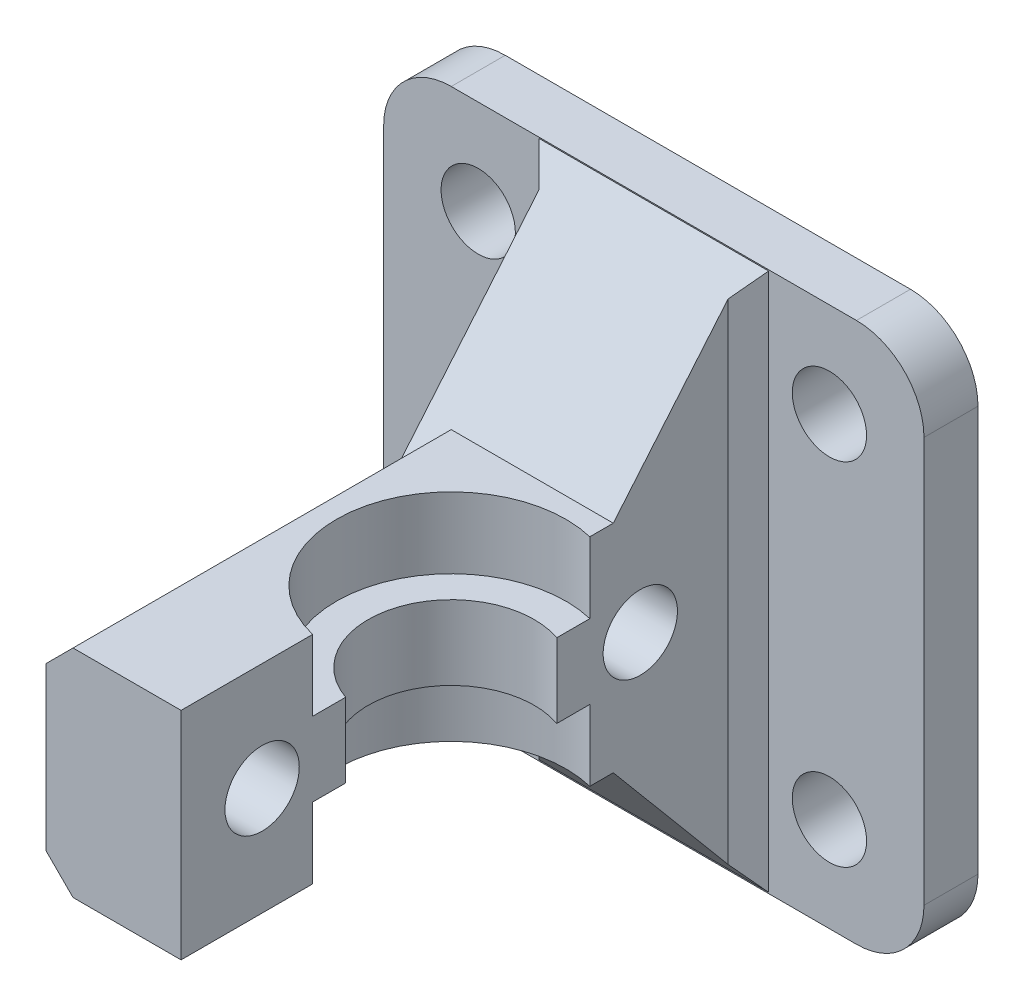
ISO-10303-21;
HEADER;
FILE_DESCRIPTION(('STEP AP214'),'2;1');
FILE_NAME('part.step','',(''),(''),'','','');
FILE_SCHEMA(('AUTOMOTIVE_DESIGN { 1 0 10303 214 1 1 1 1 }'));
ENDSEC;
DATA;
#1=APPLICATION_CONTEXT('core data for automotive mechanical design processes');
#2=APPLICATION_PROTOCOL_DEFINITION('international standard','automotive_design',2000,#1);
#3=PRODUCT_CONTEXT('',#1,'mechanical');
#4=PRODUCT('Part','Part','',(#3));
#5=PRODUCT_RELATED_PRODUCT_CATEGORY('part','',(#4));
#6=PRODUCT_DEFINITION_FORMATION('','',#4);
#7=PRODUCT_DEFINITION_CONTEXT('part definition',#1,'design');
#8=PRODUCT_DEFINITION('design','',#6,#7);
#9=PRODUCT_DEFINITION_SHAPE('','',#8);
#10=(LENGTH_UNIT() NAMED_UNIT(*) SI_UNIT(.MILLI.,.METRE.));
#11=(NAMED_UNIT(*) PLANE_ANGLE_UNIT() SI_UNIT($,.RADIAN.));
#12=(NAMED_UNIT(*) SI_UNIT($,.STERADIAN.) SOLID_ANGLE_UNIT());
#13=UNCERTAINTY_MEASURE_WITH_UNIT(LENGTH_MEASURE(1.E-05),#10,'distance_accuracy_value','');
#14=(GEOMETRIC_REPRESENTATION_CONTEXT(3) GLOBAL_UNCERTAINTY_ASSIGNED_CONTEXT((#13)) GLOBAL_UNIT_ASSIGNED_CONTEXT((#10,
#11,#12)) REPRESENTATION_CONTEXT('',''));
#15=CARTESIAN_POINT('',(0.,0.,0.));
#16=DIRECTION('',(0.,0.,1.));
#17=DIRECTION('',(1.,0.,0.));
#18=AXIS2_PLACEMENT_3D('',#15,#16,#17);
#19=CARTESIAN_POINT('',(5.,8.,24.));
#20=DIRECTION('',(0.,-1.,0.));
#21=DIRECTION('',(0.,0.,-1.));
#22=AXIS2_PLACEMENT_3D('',#19,#20,#21);
#23=CYLINDRICAL_SURFACE('',#22,8.5);
#24=CARTESIAN_POINT('',(5.,-2.75,24.));
#25=DIRECTION('',(0.,1.,0.));
#26=DIRECTION('',(0.,0.,1.));
#27=AXIS2_PLACEMENT_3D('',#24,#25,#26);
#28=CIRCLE('',#27,8.5);
#29=CARTESIAN_POINT('',(7.,-2.75,15.7386441790709));
#30=VERTEX_POINT('',#29);
#31=CARTESIAN_POINT('',(3.,-2.75,32.2613558209292));
#32=VERTEX_POINT('',#31);
#33=EDGE_CURVE('E445',#30,#32,#28,.T.);
#34=ORIENTED_EDGE('',*,*,#33,.T.);
#35=DIRECTION('',(0.,-1.,0.));
#36=VECTOR('',#35,1.);
#37=CARTESIAN_POINT('',(3.,8.,32.2613558209292));
#38=LINE('',#37,#36);
#39=CARTESIAN_POINT('',(3.,-8.,32.2613558209292));
#40=VERTEX_POINT('',#39);
#41=EDGE_CURVE('E222',#32,#40,#38,.T.);
#42=ORIENTED_EDGE('',*,*,#41,.T.);
#43=CARTESIAN_POINT('',(5.,-8.,24.));
#44=DIRECTION('',(0.,-1.,0.));
#45=DIRECTION('',(0.,0.,1.));
#46=AXIS2_PLACEMENT_3D('',#43,#44,#45);
#47=CIRCLE('',#46,8.5);
#48=CARTESIAN_POINT('',(7.,-8.,15.7386441790709));
#49=VERTEX_POINT('',#48);
#50=EDGE_CURVE('E404',#40,#49,#47,.T.);
#51=ORIENTED_EDGE('',*,*,#50,.T.);
#52=DIRECTION('',(0.,-1.,0.));
#53=VECTOR('',#52,1.);
#54=CARTESIAN_POINT('',(7.,8.,15.7386441790709));
#55=LINE('',#54,#53);
#56=EDGE_CURVE('E421',#30,#49,#55,.T.);
#57=ORIENTED_EDGE('',*,*,#56,.F.);
#58=EDGE_LOOP('',(#34,#42,#51,#57));
#59=FACE_BOUND('',#58,.T.);
#60=ADVANCED_FACE('F33',(#59),#23,.F.);
#61=CARTESIAN_POINT('',(20.,20.,4.));
#62=DIRECTION('',(-1.,0.,0.));
#63=DIRECTION('',(0.,-1.,0.));
#64=AXIS2_PLACEMENT_3D('',#61,#62,#63);
#65=PLANE('',#64);
#66=DIRECTION('',(0.,1.,0.));
#67=VECTOR('',#66,1.);
#68=CARTESIAN_POINT('',(20.,20.,4.));
#69=LINE('',#68,#67);
#70=CARTESIAN_POINT('',(20.,-15.,4.));
#71=VERTEX_POINT('',#70);
#72=CARTESIAN_POINT('',(20.,15.,4.));
#73=VERTEX_POINT('',#72);
#74=EDGE_CURVE('E258',#71,#73,#69,.T.);
#75=ORIENTED_EDGE('',*,*,#74,.F.);
#76=DIRECTION('',(0.,0.,-1.));
#77=VECTOR('',#76,1.);
#78=CARTESIAN_POINT('',(20.,-15.,4.));
#79=LINE('',#78,#77);
#80=CARTESIAN_POINT('',(20.,-15.,0.));
#81=VERTEX_POINT('',#80);
#82=EDGE_CURVE('E352',#71,#81,#79,.T.);
#83=ORIENTED_EDGE('',*,*,#82,.T.);
#84=DIRECTION('',(0.,1.,0.));
#85=VECTOR('',#84,1.);
#86=CARTESIAN_POINT('',(20.,20.,0.));
#87=LINE('',#86,#85);
#88=CARTESIAN_POINT('',(20.,15.,0.));
#89=VERTEX_POINT('',#88);
#90=EDGE_CURVE('E257',#81,#89,#87,.T.);
#91=ORIENTED_EDGE('',*,*,#90,.T.);
#92=DIRECTION('',(0.,0.,-1.));
#93=VECTOR('',#92,1.);
#94=CARTESIAN_POINT('',(20.,15.,4.));
#95=LINE('',#94,#93);
#96=EDGE_CURVE('E350',#89,#73,#95,.F.);
#97=ORIENTED_EDGE('',*,*,#96,.T.);
#98=EDGE_LOOP('',(#75,#83,#91,#97));
#99=FACE_BOUND('',#98,.T.);
#100=ADVANCED_FACE('F484',(#99),#65,.F.);
#101=CARTESIAN_POINT('',(-20.,20.,4.));
#102=DIRECTION('',(0.,-1.,0.));
#103=DIRECTION('',(0.,0.,-1.));
#104=AXIS2_PLACEMENT_3D('',#101,#102,#103);
#105=PLANE('',#104);
#106=DIRECTION('',(-1.,0.,0.));
#107=VECTOR('',#106,1.);
#108=CARTESIAN_POINT('',(-20.,20.,4.));
#109=LINE('',#108,#107);
#110=CARTESIAN_POINT('',(15.,20.,4.));
#111=VERTEX_POINT('',#110);
#112=CARTESIAN_POINT('',(-15.,20.,4.));
#113=VERTEX_POINT('',#112);
#114=EDGE_CURVE('E261',#111,#113,#109,.T.);
#115=ORIENTED_EDGE('',*,*,#114,.F.);
#116=DIRECTION('',(0.,0.,-1.));
#117=VECTOR('',#116,1.);
#118=CARTESIAN_POINT('',(15.,20.,4.));
#119=LINE('',#118,#117);
#120=CARTESIAN_POINT('',(15.,20.,0.));
#121=VERTEX_POINT('',#120);
#122=EDGE_CURVE('E357',#111,#121,#119,.T.);
#123=ORIENTED_EDGE('',*,*,#122,.T.);
#124=DIRECTION('',(-1.,0.,0.));
#125=VECTOR('',#124,1.);
#126=CARTESIAN_POINT('',(-20.,20.,0.));
#127=LINE('',#126,#125);
#128=CARTESIAN_POINT('',(-15.,20.,0.));
#129=VERTEX_POINT('',#128);
#130=EDGE_CURVE('E274',#121,#129,#127,.T.);
#131=ORIENTED_EDGE('',*,*,#130,.T.);
#132=DIRECTION('',(0.,0.,-1.));
#133=VECTOR('',#132,1.);
#134=CARTESIAN_POINT('',(-15.,20.,4.));
#135=LINE('',#134,#133);
#136=EDGE_CURVE('E355',#129,#113,#135,.F.);
#137=ORIENTED_EDGE('',*,*,#136,.T.);
#138=EDGE_LOOP('',(#115,#123,#131,#137));
#139=FACE_BOUND('',#138,.T.);
#140=ADVANCED_FACE('F488',(#139),#105,.F.);
#141=CARTESIAN_POINT('',(-20.,20.,4.));
#142=DIRECTION('',(1.,0.,0.));
#143=DIRECTION('',(0.,1.,0.));
#144=AXIS2_PLACEMENT_3D('',#141,#142,#143);
#145=PLANE('',#144);
#146=DIRECTION('',(0.,-1.,0.));
#147=VECTOR('',#146,1.);
#148=CARTESIAN_POINT('',(-20.,20.,0.));
#149=LINE('',#148,#147);
#150=CARTESIAN_POINT('',(-20.,15.,0.));
#151=VERTEX_POINT('',#150);
#152=CARTESIAN_POINT('',(-20.,-15.,0.));
#153=VERTEX_POINT('',#152);
#154=EDGE_CURVE('E277',#151,#153,#149,.T.);
#155=ORIENTED_EDGE('',*,*,#154,.T.);
#156=DIRECTION('',(0.,0.,-1.));
#157=VECTOR('',#156,1.);
#158=CARTESIAN_POINT('',(-20.,-15.,4.));
#159=LINE('',#158,#157);
#160=CARTESIAN_POINT('',(-20.,-15.,4.));
#161=VERTEX_POINT('',#160);
#162=EDGE_CURVE('E340',#153,#161,#159,.F.);
#163=ORIENTED_EDGE('',*,*,#162,.T.);
#164=DIRECTION('',(0.,-1.,0.));
#165=VECTOR('',#164,1.);
#166=CARTESIAN_POINT('',(-20.,20.,4.));
#167=LINE('',#166,#165);
#168=CARTESIAN_POINT('',(-20.,15.,4.));
#169=VERTEX_POINT('',#168);
#170=EDGE_CURVE('E265',#169,#161,#167,.T.);
#171=ORIENTED_EDGE('',*,*,#170,.F.);
#172=DIRECTION('',(0.,0.,-1.));
#173=VECTOR('',#172,1.);
#174=CARTESIAN_POINT('',(-20.,15.,4.));
#175=LINE('',#174,#173);
#176=EDGE_CURVE('E337',#169,#151,#175,.T.);
#177=ORIENTED_EDGE('',*,*,#176,.T.);
#178=EDGE_LOOP('',(#155,#163,#171,#177));
#179=FACE_BOUND('',#178,.T.);
#180=ADVANCED_FACE('F723',(#179),#145,.F.);
#181=CARTESIAN_POINT('',(-20.,-20.,4.));
#182=DIRECTION('',(0.,1.,0.));
#183=DIRECTION('',(-1.,0.,0.));
#184=AXIS2_PLACEMENT_3D('',#181,#182,#183);
#185=PLANE('',#184);
#186=DIRECTION('',(1.,0.,0.));
#187=VECTOR('',#186,1.);
#188=CARTESIAN_POINT('',(-20.,-20.,4.));
#189=LINE('',#188,#187);
#190=CARTESIAN_POINT('',(-15.,-20.,4.));
#191=VERTEX_POINT('',#190);
#192=CARTESIAN_POINT('',(15.,-20.,4.));
#193=VERTEX_POINT('',#192);
#194=EDGE_CURVE('E268',#191,#193,#189,.T.);
#195=ORIENTED_EDGE('',*,*,#194,.F.);
#196=DIRECTION('',(0.,0.,-1.));
#197=VECTOR('',#196,1.);
#198=CARTESIAN_POINT('',(-15.,-20.,4.));
#199=LINE('',#198,#197);
#200=CARTESIAN_POINT('',(-15.,-20.,0.));
#201=VERTEX_POINT('',#200);
#202=EDGE_CURVE('E326',#191,#201,#199,.T.);
#203=ORIENTED_EDGE('',*,*,#202,.T.);
#204=DIRECTION('',(1.,0.,0.));
#205=VECTOR('',#204,1.);
#206=CARTESIAN_POINT('',(-20.,-20.,0.));
#207=LINE('',#206,#205);
#208=CARTESIAN_POINT('',(15.,-20.,0.));
#209=VERTEX_POINT('',#208);
#210=EDGE_CURVE('E262',#201,#209,#207,.T.);
#211=ORIENTED_EDGE('',*,*,#210,.T.);
#212=DIRECTION('',(0.,0.,-1.));
#213=VECTOR('',#212,1.);
#214=CARTESIAN_POINT('',(15.,-20.,4.));
#215=LINE('',#214,#213);
#216=EDGE_CURVE('E324',#209,#193,#215,.F.);
#217=ORIENTED_EDGE('',*,*,#216,.T.);
#218=EDGE_LOOP('',(#195,#203,#211,#217));
#219=FACE_BOUND('',#218,.T.);
#220=ADVANCED_FACE('F716',(#219),#185,.F.);
#221=CARTESIAN_POINT('',(0.,0.,4.));
#222=DIRECTION('',(0.,0.,1.));
#223=DIRECTION('',(1.,0.,0.));
#224=AXIS2_PLACEMENT_3D('',#221,#222,#223);
#225=PLANE('',#224);
#226=DIRECTION('',(0.,-1.,0.));
#227=VECTOR('',#226,1.);
#228=CARTESIAN_POINT('',(8.50000000000001,0.,4.));
#229=LINE('',#228,#227);
#230=CARTESIAN_POINT('',(8.50000000000001,19.9175359259422,4.));
#231=VERTEX_POINT('',#230);
#232=CARTESIAN_POINT('',(8.50000000000001,-19.9175359259422,4.));
#233=VERTEX_POINT('',#232);
#234=EDGE_CURVE('E306',#231,#233,#229,.T.);
#235=ORIENTED_EDGE('',*,*,#234,.T.);
#236=DIRECTION('',(-1.,0.,0.));
#237=VECTOR('',#236,1.);
#238=CARTESIAN_POINT('',(0.,-19.9175359259422,4.));
#239=LINE('',#238,#237);
#240=CARTESIAN_POINT('',(-8.5,-19.9175359259422,4.));
#241=VERTEX_POINT('',#240);
#242=EDGE_CURVE('E283',#233,#241,#239,.T.);
#243=ORIENTED_EDGE('',*,*,#242,.T.);
#244=DIRECTION('',(0.,1.,0.));
#245=VECTOR('',#244,1.);
#246=CARTESIAN_POINT('',(-8.5,0.,4.));
#247=LINE('',#246,#245);
#248=CARTESIAN_POINT('',(-8.5,19.9175359259422,4.));
#249=VERTEX_POINT('',#248);
#250=EDGE_CURVE('E298',#241,#249,#247,.T.);
#251=ORIENTED_EDGE('',*,*,#250,.T.);
#252=DIRECTION('',(1.,0.,0.));
#253=VECTOR('',#252,1.);
#254=CARTESIAN_POINT('',(7.,19.9175359259422,4.));
#255=LINE('',#254,#253);
#256=EDGE_CURVE('E271',#249,#231,#255,.T.);
#257=ORIENTED_EDGE('',*,*,#256,.T.);
#258=EDGE_LOOP('',(#235,#243,#251,#257));
#259=FACE_BOUND('',#258,.T.);
#260=CARTESIAN_POINT('',(-13.,-13.,4.));
#261=DIRECTION('',(0.,0.,1.));
#262=DIRECTION('',(1.,0.,0.));
#263=AXIS2_PLACEMENT_3D('',#260,#261,#262);
#264=CIRCLE('',#263,2.75);
#265=CARTESIAN_POINT('',(-10.25,-13.,4.));
#266=VERTEX_POINT('',#265);
#267=EDGE_CURVE('E236',#266,#266,#264,.T.);
#268=ORIENTED_EDGE('',*,*,#267,.F.);
#269=EDGE_LOOP('',(#268));
#270=FACE_BOUND('',#269,.T.);
#271=CARTESIAN_POINT('',(13.,-13.,4.));
#272=DIRECTION('',(0.,0.,1.));
#273=DIRECTION('',(1.,0.,0.));
#274=AXIS2_PLACEMENT_3D('',#271,#272,#273);
#275=CIRCLE('',#274,2.75);
#276=CARTESIAN_POINT('',(15.75,-13.,4.));
#277=VERTEX_POINT('',#276);
#278=EDGE_CURVE('E242',#277,#277,#275,.T.);
#279=ORIENTED_EDGE('',*,*,#278,.F.);
#280=EDGE_LOOP('',(#279));
#281=FACE_BOUND('',#280,.T.);
#282=CARTESIAN_POINT('',(13.,13.,4.));
#283=DIRECTION('',(0.,0.,1.));
#284=DIRECTION('',(1.,0.,0.));
#285=AXIS2_PLACEMENT_3D('',#282,#283,#284);
#286=CIRCLE('',#285,2.75);
#287=CARTESIAN_POINT('',(15.75,13.,4.));
#288=VERTEX_POINT('',#287);
#289=EDGE_CURVE('E248',#288,#288,#286,.T.);
#290=ORIENTED_EDGE('',*,*,#289,.F.);
#291=EDGE_LOOP('',(#290));
#292=FACE_BOUND('',#291,.T.);
#293=CARTESIAN_POINT('',(-13.,13.,4.));
#294=DIRECTION('',(0.,0.,1.));
#295=DIRECTION('',(1.,0.,0.));
#296=AXIS2_PLACEMENT_3D('',#293,#294,#295);
#297=CIRCLE('',#296,2.75);
#298=CARTESIAN_POINT('',(-10.25,13.,4.));
#299=VERTEX_POINT('',#298);
#300=EDGE_CURVE('E254',#299,#299,#297,.T.);
#301=ORIENTED_EDGE('',*,*,#300,.F.);
#302=EDGE_LOOP('',(#301));
#303=FACE_BOUND('',#302,.T.);
#304=ORIENTED_EDGE('',*,*,#170,.T.);
#305=CARTESIAN_POINT('',(-15.,-15.,4.));
#306=DIRECTION('',(0.,0.,1.));
#307=DIRECTION('',(1.,0.,0.));
#308=AXIS2_PLACEMENT_3D('',#305,#306,#307);
#309=CIRCLE('',#308,5.);
#310=EDGE_CURVE('E348',#161,#191,#309,.T.);
#311=ORIENTED_EDGE('',*,*,#310,.T.);
#312=ORIENTED_EDGE('',*,*,#194,.T.);
#313=CARTESIAN_POINT('',(15.,-15.,4.));
#314=DIRECTION('',(0.,0.,1.));
#315=DIRECTION('',(1.,0.,0.));
#316=AXIS2_PLACEMENT_3D('',#313,#314,#315);
#317=CIRCLE('',#316,5.);
#318=EDGE_CURVE('E346',#193,#71,#317,.T.);
#319=ORIENTED_EDGE('',*,*,#318,.T.);
#320=ORIENTED_EDGE('',*,*,#74,.T.);
#321=CARTESIAN_POINT('',(15.,15.,4.));
#322=DIRECTION('',(0.,0.,1.));
#323=DIRECTION('',(1.,0.,0.));
#324=AXIS2_PLACEMENT_3D('',#321,#322,#323);
#325=CIRCLE('',#324,5.);
#326=EDGE_CURVE('E344',#73,#111,#325,.T.);
#327=ORIENTED_EDGE('',*,*,#326,.T.);
#328=ORIENTED_EDGE('',*,*,#114,.T.);
#329=CARTESIAN_POINT('',(-15.,15.,4.));
#330=DIRECTION('',(0.,0.,1.));
#331=DIRECTION('',(1.,0.,0.));
#332=AXIS2_PLACEMENT_3D('',#329,#330,#331);
#333=CIRCLE('',#332,5.);
#334=EDGE_CURVE('E342',#113,#169,#333,.T.);
#335=ORIENTED_EDGE('',*,*,#334,.T.);
#336=EDGE_LOOP('',(#304,#311,#312,#319,#320,#327,#328,#335));
#337=FACE_BOUND('',#336,.T.);
#338=ADVANCED_FACE('F433',(#259,#270,#281,#292,#303,#337),#225,.T.);
#339=CARTESIAN_POINT('',(0.,0.,0.));
#340=DIRECTION('',(0.,0.,1.));
#341=DIRECTION('',(1.,0.,0.));
#342=AXIS2_PLACEMENT_3D('',#339,#340,#341);
#343=PLANE('',#342);
#344=CARTESIAN_POINT('',(-13.,-13.,0.));
#345=DIRECTION('',(0.,0.,1.));
#346=DIRECTION('',(-1.,0.,0.));
#347=AXIS2_PLACEMENT_3D('',#344,#345,#346);
#348=CIRCLE('',#347,2.75);
#349=CARTESIAN_POINT('',(-15.75,-13.,0.));
#350=VERTEX_POINT('',#349);
#351=EDGE_CURVE('E233',#350,#350,#348,.T.);
#352=ORIENTED_EDGE('',*,*,#351,.T.);
#353=EDGE_LOOP('',(#352));
#354=FACE_BOUND('',#353,.T.);
#355=CARTESIAN_POINT('',(13.,-13.,0.));
#356=DIRECTION('',(0.,0.,1.));
#357=DIRECTION('',(1.,0.,0.));
#358=AXIS2_PLACEMENT_3D('',#355,#356,#357);
#359=CIRCLE('',#358,2.75);
#360=CARTESIAN_POINT('',(15.75,-13.,0.));
#361=VERTEX_POINT('',#360);
#362=EDGE_CURVE('E239',#361,#361,#359,.T.);
#363=ORIENTED_EDGE('',*,*,#362,.T.);
#364=EDGE_LOOP('',(#363));
#365=FACE_BOUND('',#364,.T.);
#366=CARTESIAN_POINT('',(13.,13.,0.));
#367=DIRECTION('',(0.,0.,1.));
#368=DIRECTION('',(-1.,0.,0.));
#369=AXIS2_PLACEMENT_3D('',#366,#367,#368);
#370=CIRCLE('',#369,2.75);
#371=CARTESIAN_POINT('',(10.25,13.,0.));
#372=VERTEX_POINT('',#371);
#373=EDGE_CURVE('E245',#372,#372,#370,.T.);
#374=ORIENTED_EDGE('',*,*,#373,.T.);
#375=EDGE_LOOP('',(#374));
#376=FACE_BOUND('',#375,.T.);
#377=CARTESIAN_POINT('',(-13.,13.,0.));
#378=DIRECTION('',(0.,0.,1.));
#379=DIRECTION('',(1.,0.,0.));
#380=AXIS2_PLACEMENT_3D('',#377,#378,#379);
#381=CIRCLE('',#380,2.75);
#382=CARTESIAN_POINT('',(-10.25,13.,0.));
#383=VERTEX_POINT('',#382);
#384=EDGE_CURVE('E251',#383,#383,#381,.T.);
#385=ORIENTED_EDGE('',*,*,#384,.T.);
#386=EDGE_LOOP('',(#385));
#387=FACE_BOUND('',#386,.T.);
#388=ORIENTED_EDGE('',*,*,#210,.F.);
#389=CARTESIAN_POINT('',(-15.,-15.,0.));
#390=DIRECTION('',(0.,0.,1.));
#391=DIRECTION('',(1.,0.,0.));
#392=AXIS2_PLACEMENT_3D('',#389,#390,#391);
#393=CIRCLE('',#392,5.);
#394=EDGE_CURVE('E335',#201,#153,#393,.F.);
#395=ORIENTED_EDGE('',*,*,#394,.T.);
#396=ORIENTED_EDGE('',*,*,#154,.F.);
#397=CARTESIAN_POINT('',(-15.,15.,0.));
#398=DIRECTION('',(0.,0.,1.));
#399=DIRECTION('',(1.,0.,0.));
#400=AXIS2_PLACEMENT_3D('',#397,#398,#399);
#401=CIRCLE('',#400,5.);
#402=EDGE_CURVE('E329',#151,#129,#401,.F.);
#403=ORIENTED_EDGE('',*,*,#402,.T.);
#404=ORIENTED_EDGE('',*,*,#130,.F.);
#405=CARTESIAN_POINT('',(15.,15.,0.));
#406=DIRECTION('',(0.,0.,1.));
#407=DIRECTION('',(1.,0.,0.));
#408=AXIS2_PLACEMENT_3D('',#405,#406,#407);
#409=CIRCLE('',#408,5.);
#410=EDGE_CURVE('E331',#121,#89,#409,.F.);
#411=ORIENTED_EDGE('',*,*,#410,.T.);
#412=ORIENTED_EDGE('',*,*,#90,.F.);
#413=CARTESIAN_POINT('',(15.,-15.,0.));
#414=DIRECTION('',(0.,0.,1.));
#415=DIRECTION('',(1.,0.,0.));
#416=AXIS2_PLACEMENT_3D('',#413,#414,#415);
#417=CIRCLE('',#416,5.);
#418=EDGE_CURVE('E333',#81,#209,#417,.F.);
#419=ORIENTED_EDGE('',*,*,#418,.T.);
#420=EDGE_LOOP('',(#388,#395,#396,#403,#404,#411,#412,#419));
#421=FACE_BOUND('',#420,.T.);
#422=ADVANCED_FACE('F702',(#354,#365,#376,#387,#421),#343,.F.);
#423=CARTESIAN_POINT('',(-13.,13.,4.001));
#424=DIRECTION('',(0.,0.,-1.));
#425=DIRECTION('',(-1.,0.,0.));
#426=AXIS2_PLACEMENT_3D('',#423,#424,#425);
#427=CYLINDRICAL_SURFACE('',#426,2.75);
#428=ORIENTED_EDGE('',*,*,#300,.T.);
#429=EDGE_LOOP('',(#428));
#430=FACE_BOUND('',#429,.T.);
#431=ORIENTED_EDGE('',*,*,#384,.F.);
#432=EDGE_LOOP('',(#431));
#433=FACE_BOUND('',#432,.T.);
#434=ADVANCED_FACE('F694',(#430,#433),#427,.F.);
#435=CARTESIAN_POINT('',(13.,13.,4.001));
#436=DIRECTION('',(0.,0.,-1.));
#437=DIRECTION('',(-1.,0.,0.));
#438=AXIS2_PLACEMENT_3D('',#435,#436,#437);
#439=CYLINDRICAL_SURFACE('',#438,2.75);
#440=ORIENTED_EDGE('',*,*,#289,.T.);
#441=EDGE_LOOP('',(#440));
#442=FACE_BOUND('',#441,.T.);
#443=ORIENTED_EDGE('',*,*,#373,.F.);
#444=EDGE_LOOP('',(#443));
#445=FACE_BOUND('',#444,.T.);
#446=ADVANCED_FACE('F686',(#442,#445),#439,.F.);
#447=CARTESIAN_POINT('',(13.,-13.,4.001));
#448=DIRECTION('',(0.,0.,-1.));
#449=DIRECTION('',(-1.,0.,0.));
#450=AXIS2_PLACEMENT_3D('',#447,#448,#449);
#451=CYLINDRICAL_SURFACE('',#450,2.75);
#452=ORIENTED_EDGE('',*,*,#278,.T.);
#453=EDGE_LOOP('',(#452));
#454=FACE_BOUND('',#453,.T.);
#455=ORIENTED_EDGE('',*,*,#362,.F.);
#456=EDGE_LOOP('',(#455));
#457=FACE_BOUND('',#456,.T.);
#458=ADVANCED_FACE('F679',(#454,#457),#451,.F.);
#459=CARTESIAN_POINT('',(-13.,-13.,4.001));
#460=DIRECTION('',(0.,0.,-1.));
#461=DIRECTION('',(-1.,0.,0.));
#462=AXIS2_PLACEMENT_3D('',#459,#460,#461);
#463=CYLINDRICAL_SURFACE('',#462,2.75);
#464=ORIENTED_EDGE('',*,*,#267,.T.);
#465=EDGE_LOOP('',(#464));
#466=FACE_BOUND('',#465,.T.);
#467=ORIENTED_EDGE('',*,*,#351,.F.);
#468=EDGE_LOOP('',(#467));
#469=FACE_BOUND('',#468,.T.);
#470=ADVANCED_FACE('F670',(#466,#469),#463,.F.);
#471=CARTESIAN_POINT('',(-7.,8.,4.));
#472=DIRECTION('',(1.,0.,0.));
#473=DIRECTION('',(0.,0.,-1.));
#474=AXIS2_PLACEMENT_3D('',#471,#472,#473);
#475=PLANE('',#474);
#476=CARTESIAN_POINT('',(-7.,0.,36.));
#477=DIRECTION('',(1.,0.,0.));
#478=DIRECTION('',(0.,0.,-1.));
#479=AXIS2_PLACEMENT_3D('',#476,#477,#478);
#480=CIRCLE('',#479,2.75);
#481=CARTESIAN_POINT('',(-7.,0.,33.25));
#482=VERTEX_POINT('',#481);
#483=EDGE_CURVE('E303',#482,#482,#480,.T.);
#484=ORIENTED_EDGE('',*,*,#483,.T.);
#485=EDGE_LOOP('',(#484));
#486=FACE_BOUND('',#485,.T.);
#487=CARTESIAN_POINT('',(-7.,0.,12.));
#488=DIRECTION('',(1.,0.,0.));
#489=DIRECTION('',(0.,0.,-1.));
#490=AXIS2_PLACEMENT_3D('',#487,#488,#489);
#491=CIRCLE('',#490,2.75);
#492=CARTESIAN_POINT('',(-7.,0.,9.25));
#493=VERTEX_POINT('',#492);
#494=EDGE_CURVE('E402',#493,#493,#491,.T.);
#495=ORIENTED_EDGE('',*,*,#494,.T.);
#496=EDGE_LOOP('',(#495));
#497=FACE_BOUND('',#496,.T.);
#498=DIRECTION('',(0.,-1.,0.));
#499=VECTOR('',#498,1.);
#500=CARTESIAN_POINT('',(-6.99999999999999,8.,42.));
#501=LINE('',#500,#499);
#502=CARTESIAN_POINT('',(-6.99999999999999,5.99999999999998,42.));
#503=VERTEX_POINT('',#502);
#504=CARTESIAN_POINT('',(-7.,-5.99999999999999,42.));
#505=VERTEX_POINT('',#504);
#506=EDGE_CURVE('E225',#503,#505,#501,.T.);
#507=ORIENTED_EDGE('',*,*,#506,.F.);
#508=DIRECTION('',(0.,0.,-1.));
#509=VECTOR('',#508,1.);
#510=CARTESIAN_POINT('',(-7.,5.99999999999998,14.));
#511=LINE('',#510,#509);
#512=CARTESIAN_POINT('',(-7.,5.99999999999999,15.6781992623545));
#513=VERTEX_POINT('',#512);
#514=EDGE_CURVE('E370',#503,#513,#511,.T.);
#515=ORIENTED_EDGE('',*,*,#514,.T.);
#516=DIRECTION('',(0.,-0.766044443118981,0.642787609686536));
#517=VECTOR('',#516,1.);
#518=CARTESIAN_POINT('',(-7.,12.924038765061,9.86824088833468));
#519=LINE('',#518,#517);
#520=CARTESIAN_POINT('',(-7.,18.1299055370508,5.50000000000001));
#521=VERTEX_POINT('',#520);
#522=EDGE_CURVE('E56',#513,#521,#519,.F.);
#523=ORIENTED_EDGE('',*,*,#522,.T.);
#524=DIRECTION('',(0.,-1.,0.));
#525=VECTOR('',#524,1.);
#526=CARTESIAN_POINT('',(-7.,8.,5.50000000000001));
#527=LINE('',#526,#525);
#528=CARTESIAN_POINT('',(-7.,-18.1299055370508,5.50000000000001));
#529=VERTEX_POINT('',#528);
#530=EDGE_CURVE('E311',#521,#529,#527,.T.);
#531=ORIENTED_EDGE('',*,*,#530,.T.);
#532=DIRECTION('',(0.,0.766044443118981,0.642787609686536));
#533=VECTOR('',#532,1.);
#534=CARTESIAN_POINT('',(-7.,-3.53485334372549,17.7467029124323));
#535=LINE('',#534,#533);
#536=CARTESIAN_POINT('',(-7.,-5.99999999999999,15.6781992623545));
#537=VERTEX_POINT('',#536);
#538=EDGE_CURVE('E290',#529,#537,#535,.T.);
#539=ORIENTED_EDGE('',*,*,#538,.T.);
#540=DIRECTION('',(0.,0.,1.));
#541=VECTOR('',#540,1.);
#542=CARTESIAN_POINT('',(-7.,-5.99999999999999,4.));
#543=LINE('',#542,#541);
#544=EDGE_CURVE('E367',#537,#505,#543,.T.);
#545=ORIENTED_EDGE('',*,*,#544,.T.);
#546=EDGE_LOOP('',(#507,#515,#523,#531,#539,#545));
#547=FACE_BOUND('',#546,.T.);
#548=ADVANCED_FACE('F392',(#486,#497,#547),#475,.F.);
#549=CARTESIAN_POINT('',(-6.99999999999999,8.,42.));
#550=DIRECTION('',(0.,0.,-1.));
#551=DIRECTION('',(-1.,0.,0.));
#552=AXIS2_PLACEMENT_3D('',#549,#550,#551);
#553=PLANE('',#552);
#554=DIRECTION('',(1.,0.,0.));
#555=VECTOR('',#554,1.);
#556=CARTESIAN_POINT('',(-6.99999999999999,8.,42.));
#557=LINE('',#556,#555);
#558=CARTESIAN_POINT('',(-4.99999999999999,8.,42.));
#559=VERTEX_POINT('',#558);
#560=CARTESIAN_POINT('',(3.00000000000001,8.,42.));
#561=VERTEX_POINT('',#560);
#562=EDGE_CURVE('E390',#559,#561,#557,.T.);
#563=ORIENTED_EDGE('',*,*,#562,.F.);
#564=DIRECTION('',(-0.707106781186546,-0.707106781186549,0.));
#565=VECTOR('',#564,1.);
#566=CARTESIAN_POINT('',(-4.99999999999999,8.,42.));
#567=LINE('',#566,#565);
#568=EDGE_CURVE('E365',#559,#503,#567,.T.);
#569=ORIENTED_EDGE('',*,*,#568,.T.);
#570=ORIENTED_EDGE('',*,*,#506,.T.);
#571=DIRECTION('',(-0.707106781186549,0.707106781186547,0.));
#572=VECTOR('',#571,1.);
#573=CARTESIAN_POINT('',(-7.,-5.99999999999999,42.));
#574=LINE('',#573,#572);
#575=CARTESIAN_POINT('',(-4.99999999999998,-8.,42.));
#576=VERTEX_POINT('',#575);
#577=EDGE_CURVE('E363',#505,#576,#574,.F.);
#578=ORIENTED_EDGE('',*,*,#577,.T.);
#579=DIRECTION('',(1.,0.,0.));
#580=VECTOR('',#579,1.);
#581=CARTESIAN_POINT('',(-6.99999999999999,-8.,42.));
#582=LINE('',#581,#580);
#583=CARTESIAN_POINT('',(3.00000000000001,-8.,42.));
#584=VERTEX_POINT('',#583);
#585=EDGE_CURVE('E397',#576,#584,#582,.T.);
#586=ORIENTED_EDGE('',*,*,#585,.T.);
#587=DIRECTION('',(0.,-1.,0.));
#588=VECTOR('',#587,1.);
#589=CARTESIAN_POINT('',(3.00000000000001,8.,42.));
#590=LINE('',#589,#588);
#591=EDGE_CURVE('E221',#561,#584,#590,.T.);
#592=ORIENTED_EDGE('',*,*,#591,.F.);
#593=EDGE_LOOP('',(#563,#569,#570,#578,#586,#592));
#594=FACE_BOUND('',#593,.T.);
#595=ADVANCED_FACE('F388',(#594),#553,.F.);
#596=CARTESIAN_POINT('',(3.00000000000001,8.,42.));
#597=DIRECTION('',(-1.,0.,0.));
#598=DIRECTION('',(0.,0.,1.));
#599=AXIS2_PLACEMENT_3D('',#596,#597,#598);
#600=PLANE('',#599);
#601=CARTESIAN_POINT('',(3.00000000000001,0.,36.));
#602=DIRECTION('',(-1.,0.,0.));
#603=DIRECTION('',(0.,0.,1.));
#604=AXIS2_PLACEMENT_3D('',#601,#602,#603);
#605=CIRCLE('',#604,2.75);
#606=CARTESIAN_POINT('',(3.00000000000001,0.,38.75));
#607=VERTEX_POINT('',#606);
#608=EDGE_CURVE('E299',#607,#607,#605,.T.);
#609=ORIENTED_EDGE('',*,*,#608,.T.);
#610=EDGE_LOOP('',(#609));
#611=FACE_BOUND('',#610,.T.);
#612=DIRECTION('',(0.,0.,-1.));
#613=VECTOR('',#612,1.);
#614=CARTESIAN_POINT('',(3.00000000000001,-8.,42.));
#615=LINE('',#614,#613);
#616=EDGE_CURVE('E401',#584,#40,#615,.T.);
#617=ORIENTED_EDGE('',*,*,#616,.T.);
#618=ORIENTED_EDGE('',*,*,#41,.F.);
#619=DIRECTION('',(0.,0.,-1.));
#620=VECTOR('',#619,1.);
#621=CARTESIAN_POINT('',(3.,-2.75,29.8157114784006));
#622=LINE('',#621,#620);
#623=CARTESIAN_POINT('',(3.,-2.75,29.8157114784006));
#624=VERTEX_POINT('',#623);
#625=EDGE_CURVE('E446',#32,#624,#622,.T.);
#626=ORIENTED_EDGE('',*,*,#625,.T.);
#627=DIRECTION('',(0.,-1.,0.));
#628=VECTOR('',#627,1.);
#629=CARTESIAN_POINT('',(3.,2.75,29.8157114784006));
#630=LINE('',#629,#628);
#631=CARTESIAN_POINT('',(3.,2.75,29.8157114784006));
#632=VERTEX_POINT('',#631);
#633=EDGE_CURVE('E204',#632,#624,#630,.T.);
#634=ORIENTED_EDGE('',*,*,#633,.F.);
#635=DIRECTION('',(0.,0.,-1.));
#636=VECTOR('',#635,1.);
#637=CARTESIAN_POINT('',(3.,2.75,29.8157114784006));
#638=LINE('',#637,#636);
#639=CARTESIAN_POINT('',(3.,2.75,32.2613558209292));
#640=VERTEX_POINT('',#639);
#641=EDGE_CURVE('E195',#640,#632,#638,.T.);
#642=ORIENTED_EDGE('',*,*,#641,.F.);
#643=CARTESIAN_POINT('',(3.,8.,32.2613558209292));
#644=VERTEX_POINT('',#643);
#645=EDGE_CURVE('E201',#644,#640,#38,.T.);
#646=ORIENTED_EDGE('',*,*,#645,.F.);
#647=DIRECTION('',(0.,0.,-1.));
#648=VECTOR('',#647,1.);
#649=CARTESIAN_POINT('',(3.00000000000001,8.,42.));
#650=LINE('',#649,#648);
#651=EDGE_CURVE('E417',#561,#644,#650,.T.);
#652=ORIENTED_EDGE('',*,*,#651,.F.);
#653=ORIENTED_EDGE('',*,*,#591,.T.);
#654=EDGE_LOOP('',(#617,#618,#626,#634,#642,#646,#652,#653));
#655=FACE_BOUND('',#654,.T.);
#656=ADVANCED_FACE('F198',(#611,#655),#600,.F.);
#657=ORIENTED_EDGE('',*,*,#645,.T.);
#658=CARTESIAN_POINT('',(5.,2.75,24.));
#659=DIRECTION('',(0.,1.,0.));
#660=DIRECTION('',(0.,0.,1.));
#661=AXIS2_PLACEMENT_3D('',#658,#659,#660);
#662=CIRCLE('',#661,8.5);
#663=CARTESIAN_POINT('',(7.,2.75,15.7386441790709));
#664=VERTEX_POINT('',#663);
#665=EDGE_CURVE('E208',#664,#640,#662,.T.);
#666=ORIENTED_EDGE('',*,*,#665,.F.);
#667=CARTESIAN_POINT('',(7.,8.,15.7386441790709));
#668=VERTEX_POINT('',#667);
#669=EDGE_CURVE('E227',#668,#664,#55,.T.);
#670=ORIENTED_EDGE('',*,*,#669,.F.);
#671=CARTESIAN_POINT('',(5.,8.,24.));
#672=DIRECTION('',(0.,-1.,0.));
#673=DIRECTION('',(0.,0.,1.));
#674=AXIS2_PLACEMENT_3D('',#671,#672,#673);
#675=CIRCLE('',#674,8.5);
#676=EDGE_CURVE('E220',#644,#668,#675,.T.);
#677=ORIENTED_EDGE('',*,*,#676,.F.);
#678=EDGE_LOOP('',(#657,#666,#670,#677));
#679=FACE_BOUND('',#678,.T.);
#680=ADVANCED_FACE('F219',(#679),#23,.F.);
#681=CARTESIAN_POINT('',(7.,8.,15.7386441790709));
#682=DIRECTION('',(-1.,0.,0.));
#683=DIRECTION('',(0.,0.,1.));
#684=AXIS2_PLACEMENT_3D('',#681,#682,#683);
#685=PLANE('',#684);
#686=CARTESIAN_POINT('',(7.,0.,12.));
#687=DIRECTION('',(1.,0.,0.));
#688=DIRECTION('',(0.,0.,-1.));
#689=AXIS2_PLACEMENT_3D('',#686,#687,#688);
#690=CIRCLE('',#689,2.75);
#691=CARTESIAN_POINT('',(7.,0.,9.25));
#692=VERTEX_POINT('',#691);
#693=EDGE_CURVE('E302',#692,#692,#690,.T.);
#694=ORIENTED_EDGE('',*,*,#693,.F.);
#695=EDGE_LOOP('',(#694));
#696=FACE_BOUND('',#695,.T.);
#697=DIRECTION('',(0.,-0.766044443118981,-0.642787609686536));
#698=VECTOR('',#697,1.);
#699=CARTESIAN_POINT('',(7.,2.2453005549748,22.5968279169796));
#700=LINE('',#699,#698);
#701=CARTESIAN_POINT('',(7.,-8.,14.));
#702=VERTEX_POINT('',#701);
#703=CARTESIAN_POINT('',(7.,-18.1299055370508,5.5));
#704=VERTEX_POINT('',#703);
#705=EDGE_CURVE('E292',#702,#704,#700,.T.);
#706=ORIENTED_EDGE('',*,*,#705,.T.);
#707=DIRECTION('',(0.,1.,0.));
#708=VECTOR('',#707,1.);
#709=CARTESIAN_POINT('',(7.,8.,5.5));
#710=LINE('',#709,#708);
#711=CARTESIAN_POINT('',(7.,18.1299055370508,5.5));
#712=VERTEX_POINT('',#711);
#713=EDGE_CURVE('E309',#704,#712,#710,.T.);
#714=ORIENTED_EDGE('',*,*,#713,.T.);
#715=DIRECTION('',(0.,0.766044443118981,-0.642787609686536));
#716=VECTOR('',#715,1.);
#717=CARTESIAN_POINT('',(7.,7.14388486636072,14.718365892882));
#718=LINE('',#717,#716);
#719=CARTESIAN_POINT('',(7.,8.,14.));
#720=VERTEX_POINT('',#719);
#721=EDGE_CURVE('E296',#712,#720,#718,.F.);
#722=ORIENTED_EDGE('',*,*,#721,.T.);
#723=DIRECTION('',(0.,0.,-1.));
#724=VECTOR('',#723,1.);
#725=CARTESIAN_POINT('',(7.,8.,15.7386441790709));
#726=LINE('',#725,#724);
#727=EDGE_CURVE('E384',#668,#720,#726,.T.);
#728=ORIENTED_EDGE('',*,*,#727,.F.);
#729=ORIENTED_EDGE('',*,*,#669,.T.);
#730=DIRECTION('',(0.,0.,-1.));
#731=VECTOR('',#730,1.);
#732=CARTESIAN_POINT('',(7.,2.75,15.7386441790709));
#733=LINE('',#732,#731);
#734=CARTESIAN_POINT('',(7.,2.75,18.1842885215995));
#735=VERTEX_POINT('',#734);
#736=EDGE_CURVE('E213',#735,#664,#733,.T.);
#737=ORIENTED_EDGE('',*,*,#736,.F.);
#738=DIRECTION('',(0.,-1.,0.));
#739=VECTOR('',#738,1.);
#740=CARTESIAN_POINT('',(7.,2.75,18.1842885215995));
#741=LINE('',#740,#739);
#742=CARTESIAN_POINT('',(7.,-2.75,18.1842885215995));
#743=VERTEX_POINT('',#742);
#744=EDGE_CURVE('E454',#735,#743,#741,.T.);
#745=ORIENTED_EDGE('',*,*,#744,.T.);
#746=DIRECTION('',(0.,0.,-1.));
#747=VECTOR('',#746,1.);
#748=CARTESIAN_POINT('',(7.,-2.75,15.7386441790709));
#749=LINE('',#748,#747);
#750=EDGE_CURVE('E217',#743,#30,#749,.T.);
#751=ORIENTED_EDGE('',*,*,#750,.T.);
#752=ORIENTED_EDGE('',*,*,#56,.T.);
#753=DIRECTION('',(0.,0.,-1.));
#754=VECTOR('',#753,1.);
#755=CARTESIAN_POINT('',(7.,-8.,15.7386441790709));
#756=LINE('',#755,#754);
#757=EDGE_CURVE('E412',#49,#702,#756,.T.);
#758=ORIENTED_EDGE('',*,*,#757,.T.);
#759=EDGE_LOOP('',(#706,#714,#722,#728,#729,#737,#745,#751,#752,#758));
#760=FACE_BOUND('',#759,.T.);
#761=ADVANCED_FACE('F424',(#696,#760),#685,.F.);
#762=CARTESIAN_POINT('',(5.,8.,24.));
#763=DIRECTION('',(0.,1.,0.));
#764=DIRECTION('',(0.,0.,1.));
#765=AXIS2_PLACEMENT_3D('',#762,#763,#764);
#766=PLANE('',#765);
#767=DIRECTION('',(-1.,0.,0.));
#768=VECTOR('',#767,1.);
#769=CARTESIAN_POINT('',(-7.,8.,14.));
#770=LINE('',#769,#768);
#771=CARTESIAN_POINT('',(-4.99999999999999,8.,14.));
#772=VERTEX_POINT('',#771);
#773=EDGE_CURVE('E287',#720,#772,#770,.T.);
#774=ORIENTED_EDGE('',*,*,#773,.T.);
#775=DIRECTION('',(0.,0.,1.));
#776=VECTOR('',#775,1.);
#777=CARTESIAN_POINT('',(-4.99999999999999,8.,42.));
#778=LINE('',#777,#776);
#779=EDGE_CURVE('E360',#772,#559,#778,.T.);
#780=ORIENTED_EDGE('',*,*,#779,.T.);
#781=ORIENTED_EDGE('',*,*,#562,.T.);
#782=ORIENTED_EDGE('',*,*,#651,.T.);
#783=ORIENTED_EDGE('',*,*,#676,.T.);
#784=ORIENTED_EDGE('',*,*,#727,.T.);
#785=EDGE_LOOP('',(#774,#780,#781,#782,#783,#784));
#786=FACE_BOUND('',#785,.T.);
#787=ADVANCED_FACE('F381',(#786),#766,.T.);
#788=CARTESIAN_POINT('',(5.,-8.,24.));
#789=DIRECTION('',(0.,1.,0.));
#790=DIRECTION('',(0.,0.,1.));
#791=AXIS2_PLACEMENT_3D('',#788,#789,#790);
#792=PLANE('',#791);
#793=ORIENTED_EDGE('',*,*,#585,.F.);
#794=DIRECTION('',(0.,0.,-1.));
#795=VECTOR('',#794,1.);
#796=CARTESIAN_POINT('',(-4.99999999999998,-8.,24.));
#797=LINE('',#796,#795);
#798=CARTESIAN_POINT('',(-4.99999999999998,-8.,14.));
#799=VERTEX_POINT('',#798);
#800=EDGE_CURVE('E48',#576,#799,#797,.T.);
#801=ORIENTED_EDGE('',*,*,#800,.T.);
#802=DIRECTION('',(1.,0.,0.));
#803=VECTOR('',#802,1.);
#804=CARTESIAN_POINT('',(5.,-8.,14.));
#805=LINE('',#804,#803);
#806=EDGE_CURVE('E285',#799,#702,#805,.T.);
#807=ORIENTED_EDGE('',*,*,#806,.T.);
#808=ORIENTED_EDGE('',*,*,#757,.F.);
#809=ORIENTED_EDGE('',*,*,#50,.F.);
#810=ORIENTED_EDGE('',*,*,#616,.F.);
#811=EDGE_LOOP('',(#793,#801,#807,#808,#809,#810));
#812=FACE_BOUND('',#811,.T.);
#813=ADVANCED_FACE('F399',(#812),#792,.F.);
#814=CARTESIAN_POINT('',(0.,-19.9175359259422,4.));
#815=DIRECTION('',(0.,0.642787609686536,-0.766044443118981));
#816=DIRECTION('',(-1.,0.,0.));
#817=AXIS2_PLACEMENT_3D('',#814,#815,#816);
#818=PLANE('',#817);
#819=ORIENTED_EDGE('',*,*,#705,.F.);
#820=ORIENTED_EDGE('',*,*,#806,.F.);
#821=DIRECTION('',(0.608120402411346,-0.608120402411344,-0.510273605374733));
#822=VECTOR('',#821,1.);
#823=CARTESIAN_POINT('',(4.35935903331763,-17.3593590333176,6.14656528708751));
#824=LINE('',#823,#822);
#825=EDGE_CURVE('E11',#799,#537,#824,.F.);
#826=ORIENTED_EDGE('',*,*,#825,.T.);
#827=ORIENTED_EDGE('',*,*,#538,.F.);
#828=DIRECTION('',(-0.540716203060933,-0.644400477571776,-0.540716203060935));
#829=VECTOR('',#828,1.);
#830=CARTESIAN_POINT('',(-6.01482089585263,-16.9558148003344,6.48517910414738));
#831=LINE('',#830,#829);
#832=EDGE_CURVE('E319',#529,#241,#831,.T.);
#833=ORIENTED_EDGE('',*,*,#832,.T.);
#834=ORIENTED_EDGE('',*,*,#242,.F.);
#835=DIRECTION('',(-0.540716203060936,0.644400477571775,0.540716203060934));
#836=VECTOR('',#835,1.);
#837=CARTESIAN_POINT('',(6.0148208958526,-16.9558148003344,6.4851791041474));
#838=LINE('',#837,#836);
#839=EDGE_CURVE('E314',#233,#704,#838,.T.);
#840=ORIENTED_EDGE('',*,*,#839,.T.);
#841=EDGE_LOOP('',(#819,#820,#826,#827,#833,#834,#840));
#842=FACE_BOUND('',#841,.T.);
#843=ADVANCED_FACE('F441',(#842),#818,.F.);
#844=CARTESIAN_POINT('',(5.,8.,14.));
#845=DIRECTION('',(0.,0.642787609686536,0.766044443118981));
#846=DIRECTION('',(1.,0.,0.));
#847=AXIS2_PLACEMENT_3D('',#844,#845,#846);
#848=PLANE('',#847);
#849=ORIENTED_EDGE('',*,*,#721,.F.);
#850=DIRECTION('',(-0.540716203060936,-0.644400477571775,0.540716203060934));
#851=VECTOR('',#850,1.);
#852=CARTESIAN_POINT('',(0.400431079642137,10.2648455666412,12.0995689203578));
#853=LINE('',#852,#851);
#854=EDGE_CURVE('E316',#712,#231,#853,.F.);
#855=ORIENTED_EDGE('',*,*,#854,.T.);
#856=ORIENTED_EDGE('',*,*,#256,.F.);
#857=DIRECTION('',(-0.540716203060933,0.644400477571776,-0.540716203060935));
#858=VECTOR('',#857,1.);
#859=CARTESIAN_POINT('',(2.52330904288415,6.78046777180855,15.0233090428842));
#860=LINE('',#859,#858);
#861=EDGE_CURVE('E322',#249,#521,#860,.F.);
#862=ORIENTED_EDGE('',*,*,#861,.T.);
#863=ORIENTED_EDGE('',*,*,#522,.F.);
#864=DIRECTION('',(-0.608120402411343,-0.608120402411345,0.510273605374734));
#865=VECTOR('',#864,1.);
#866=CARTESIAN_POINT('',(-1.30189576171066,11.6981042382893,10.8969220975963));
#867=LINE('',#866,#865);
#868=EDGE_CURVE('E41',#513,#772,#867,.F.);
#869=ORIENTED_EDGE('',*,*,#868,.T.);
#870=ORIENTED_EDGE('',*,*,#773,.F.);
#871=EDGE_LOOP('',(#849,#855,#856,#862,#863,#869,#870));
#872=FACE_BOUND('',#871,.T.);
#873=ADVANCED_FACE('F375',(#872),#848,.T.);
#874=CARTESIAN_POINT('',(-7.,0.,12.));
#875=DIRECTION('',(1.,0.,0.));
#876=DIRECTION('',(0.,0.,-1.));
#877=AXIS2_PLACEMENT_3D('',#874,#875,#876);
#878=CYLINDRICAL_SURFACE('',#877,2.75);
#879=ORIENTED_EDGE('',*,*,#494,.F.);
#880=EDGE_LOOP('',(#879));
#881=FACE_BOUND('',#880,.T.);
#882=ORIENTED_EDGE('',*,*,#693,.T.);
#883=EDGE_LOOP('',(#882));
#884=FACE_BOUND('',#883,.T.);
#885=ADVANCED_FACE('F471',(#881,#884),#878,.F.);
#886=CARTESIAN_POINT('',(-7.,0.,36.));
#887=DIRECTION('',(1.,0.,0.));
#888=DIRECTION('',(0.,0.,-1.));
#889=AXIS2_PLACEMENT_3D('',#886,#887,#888);
#890=CYLINDRICAL_SURFACE('',#889,2.75);
#891=ORIENTED_EDGE('',*,*,#483,.F.);
#892=EDGE_LOOP('',(#891));
#893=FACE_BOUND('',#892,.T.);
#894=ORIENTED_EDGE('',*,*,#608,.F.);
#895=EDGE_LOOP('',(#894));
#896=FACE_BOUND('',#895,.T.);
#897=ADVANCED_FACE('F468',(#893,#896),#890,.F.);
#898=CARTESIAN_POINT('',(5.,2.75,24.));
#899=DIRECTION('',(0.,-1.,0.));
#900=DIRECTION('',(0.,0.,-1.));
#901=AXIS2_PLACEMENT_3D('',#898,#899,#900);
#902=CYLINDRICAL_SURFACE('',#901,6.15);
#903=CARTESIAN_POINT('',(5.,-2.75,24.));
#904=DIRECTION('',(0.,-1.,0.));
#905=DIRECTION('',(0.,0.,1.));
#906=AXIS2_PLACEMENT_3D('',#903,#904,#905);
#907=CIRCLE('',#906,6.15);
#908=EDGE_CURVE('E449',#624,#743,#907,.T.);
#909=ORIENTED_EDGE('',*,*,#908,.T.);
#910=ORIENTED_EDGE('',*,*,#744,.F.);
#911=CARTESIAN_POINT('',(5.,2.75,24.));
#912=DIRECTION('',(0.,-1.,0.));
#913=DIRECTION('',(0.,0.,1.));
#914=AXIS2_PLACEMENT_3D('',#911,#912,#913);
#915=CIRCLE('',#914,6.15);
#916=EDGE_CURVE('E207',#632,#735,#915,.T.);
#917=ORIENTED_EDGE('',*,*,#916,.F.);
#918=ORIENTED_EDGE('',*,*,#633,.T.);
#919=EDGE_LOOP('',(#909,#910,#917,#918));
#920=FACE_BOUND('',#919,.T.);
#921=ADVANCED_FACE('F452',(#920),#902,.F.);
#922=CARTESIAN_POINT('',(5.,2.75,24.));
#923=DIRECTION('',(0.,1.,0.));
#924=DIRECTION('',(0.,0.,1.));
#925=AXIS2_PLACEMENT_3D('',#922,#923,#924);
#926=PLANE('',#925);
#927=ORIENTED_EDGE('',*,*,#665,.T.);
#928=ORIENTED_EDGE('',*,*,#641,.T.);
#929=ORIENTED_EDGE('',*,*,#916,.T.);
#930=ORIENTED_EDGE('',*,*,#736,.T.);
#931=EDGE_LOOP('',(#927,#928,#929,#930));
#932=FACE_BOUND('',#931,.T.);
#933=ADVANCED_FACE('F211',(#932),#926,.T.);
#934=CARTESIAN_POINT('',(5.,-2.75,24.));
#935=DIRECTION('',(0.,1.,0.));
#936=DIRECTION('',(0.,0.,1.));
#937=AXIS2_PLACEMENT_3D('',#934,#935,#936);
#938=PLANE('',#937);
#939=ORIENTED_EDGE('',*,*,#33,.F.);
#940=ORIENTED_EDGE('',*,*,#750,.F.);
#941=ORIENTED_EDGE('',*,*,#908,.F.);
#942=ORIENTED_EDGE('',*,*,#625,.F.);
#943=EDGE_LOOP('',(#939,#940,#941,#942));
#944=FACE_BOUND('',#943,.T.);
#945=ADVANCED_FACE('F457',(#944),#938,.F.);
#946=CARTESIAN_POINT('',(8.50000000000001,0.,4.));
#947=DIRECTION('',(-0.707106781186546,0.,-0.707106781186549));
#948=DIRECTION('',(0.,-1.,0.));
#949=AXIS2_PLACEMENT_3D('',#946,#947,#948);
#950=PLANE('',#949);
#951=ORIENTED_EDGE('',*,*,#854,.F.);
#952=ORIENTED_EDGE('',*,*,#713,.F.);
#953=ORIENTED_EDGE('',*,*,#839,.F.);
#954=ORIENTED_EDGE('',*,*,#234,.F.);
#955=EDGE_LOOP('',(#951,#952,#953,#954));
#956=FACE_BOUND('',#955,.T.);
#957=ADVANCED_FACE('F430',(#956),#950,.F.);
#958=CARTESIAN_POINT('',(-7.,8.,5.50000000000001));
#959=DIRECTION('',(0.707106781186549,0.,-0.707106781186546));
#960=DIRECTION('',(0.,-1.,0.));
#961=AXIS2_PLACEMENT_3D('',#958,#959,#960);
#962=PLANE('',#961);
#963=ORIENTED_EDGE('',*,*,#861,.F.);
#964=ORIENTED_EDGE('',*,*,#250,.F.);
#965=ORIENTED_EDGE('',*,*,#832,.F.);
#966=ORIENTED_EDGE('',*,*,#530,.F.);
#967=EDGE_LOOP('',(#963,#964,#965,#966));
#968=FACE_BOUND('',#967,.T.);
#969=ADVANCED_FACE('F439',(#968),#962,.F.);
#970=CARTESIAN_POINT('',(-15.,-15.,4.));
#971=DIRECTION('',(0.,0.,-1.));
#972=DIRECTION('',(-1.,0.,0.));
#973=AXIS2_PLACEMENT_3D('',#970,#971,#972);
#974=CYLINDRICAL_SURFACE('',#973,5.);
#975=ORIENTED_EDGE('',*,*,#310,.F.);
#976=ORIENTED_EDGE('',*,*,#162,.F.);
#977=ORIENTED_EDGE('',*,*,#394,.F.);
#978=ORIENTED_EDGE('',*,*,#202,.F.);
#979=EDGE_LOOP('',(#975,#976,#977,#978));
#980=FACE_BOUND('',#979,.T.);
#981=ADVANCED_FACE('F528',(#980),#974,.T.);
#982=CARTESIAN_POINT('',(15.,-15.,4.));
#983=DIRECTION('',(0.,0.,-1.));
#984=DIRECTION('',(-1.,0.,0.));
#985=AXIS2_PLACEMENT_3D('',#982,#983,#984);
#986=CYLINDRICAL_SURFACE('',#985,5.);
#987=ORIENTED_EDGE('',*,*,#318,.F.);
#988=ORIENTED_EDGE('',*,*,#216,.F.);
#989=ORIENTED_EDGE('',*,*,#418,.F.);
#990=ORIENTED_EDGE('',*,*,#82,.F.);
#991=EDGE_LOOP('',(#987,#988,#989,#990));
#992=FACE_BOUND('',#991,.T.);
#993=ADVANCED_FACE('F536',(#992),#986,.T.);
#994=CARTESIAN_POINT('',(15.,15.,4.));
#995=DIRECTION('',(0.,0.,-1.));
#996=DIRECTION('',(-1.,0.,0.));
#997=AXIS2_PLACEMENT_3D('',#994,#995,#996);
#998=CYLINDRICAL_SURFACE('',#997,5.);
#999=ORIENTED_EDGE('',*,*,#326,.F.);
#1000=ORIENTED_EDGE('',*,*,#96,.F.);
#1001=ORIENTED_EDGE('',*,*,#410,.F.);
#1002=ORIENTED_EDGE('',*,*,#122,.F.);
#1003=EDGE_LOOP('',(#999,#1000,#1001,#1002));
#1004=FACE_BOUND('',#1003,.T.);
#1005=ADVANCED_FACE('F545',(#1004),#998,.T.);
#1006=CARTESIAN_POINT('',(-15.,15.,4.));
#1007=DIRECTION('',(0.,0.,-1.));
#1008=DIRECTION('',(-1.,0.,0.));
#1009=AXIS2_PLACEMENT_3D('',#1006,#1007,#1008);
#1010=CYLINDRICAL_SURFACE('',#1009,5.);
#1011=ORIENTED_EDGE('',*,*,#334,.F.);
#1012=ORIENTED_EDGE('',*,*,#136,.F.);
#1013=ORIENTED_EDGE('',*,*,#402,.F.);
#1014=ORIENTED_EDGE('',*,*,#176,.F.);
#1015=EDGE_LOOP('',(#1011,#1012,#1013,#1014));
#1016=FACE_BOUND('',#1015,.T.);
#1017=ADVANCED_FACE('F553',(#1016),#1010,.T.);
#1018=CARTESIAN_POINT('',(-4.99999999999999,8.,24.));
#1019=DIRECTION('',(-0.707106781186549,0.707106781186546,0.));
#1020=DIRECTION('',(0.,0.,-1.));
#1021=AXIS2_PLACEMENT_3D('',#1018,#1019,#1020);
#1022=PLANE('',#1021);
#1023=ORIENTED_EDGE('',*,*,#868,.F.);
#1024=ORIENTED_EDGE('',*,*,#514,.F.);
#1025=ORIENTED_EDGE('',*,*,#568,.F.);
#1026=ORIENTED_EDGE('',*,*,#779,.F.);
#1027=EDGE_LOOP('',(#1023,#1024,#1025,#1026));
#1028=FACE_BOUND('',#1027,.T.);
#1029=ADVANCED_FACE('F385',(#1028),#1022,.T.);
#1030=CARTESIAN_POINT('',(-7.,-5.99999999999999,4.));
#1031=DIRECTION('',(0.707106781186547,0.707106781186549,0.));
#1032=DIRECTION('',(0.,0.,1.));
#1033=AXIS2_PLACEMENT_3D('',#1030,#1031,#1032);
#1034=PLANE('',#1033);
#1035=ORIENTED_EDGE('',*,*,#825,.F.);
#1036=ORIENTED_EDGE('',*,*,#800,.F.);
#1037=ORIENTED_EDGE('',*,*,#577,.F.);
#1038=ORIENTED_EDGE('',*,*,#544,.F.);
#1039=EDGE_LOOP('',(#1035,#1036,#1037,#1038));
#1040=FACE_BOUND('',#1039,.T.);
#1041=ADVANCED_FACE('F35',(#1040),#1034,.F.);
#1042=CLOSED_SHELL('',(#60,#100,#140,#180,#220,#338,#422,#434,#446,#458,#470,#548,#595,#656,
#680,#761,#787,#813,#843,#873,#885,#897,#921,#933,#945,#957,#969,#981,#993,#1005,#1017,#1029,#1041));
#1043=MANIFOLD_SOLID_BREP('B2',#1042);
#1044=ADVANCED_BREP_SHAPE_REPRESENTATION('',(#18,#1043),#14);
#1045=SHAPE_DEFINITION_REPRESENTATION(#9,#1044);
ENDSEC;
END-ISO-10303-21;
